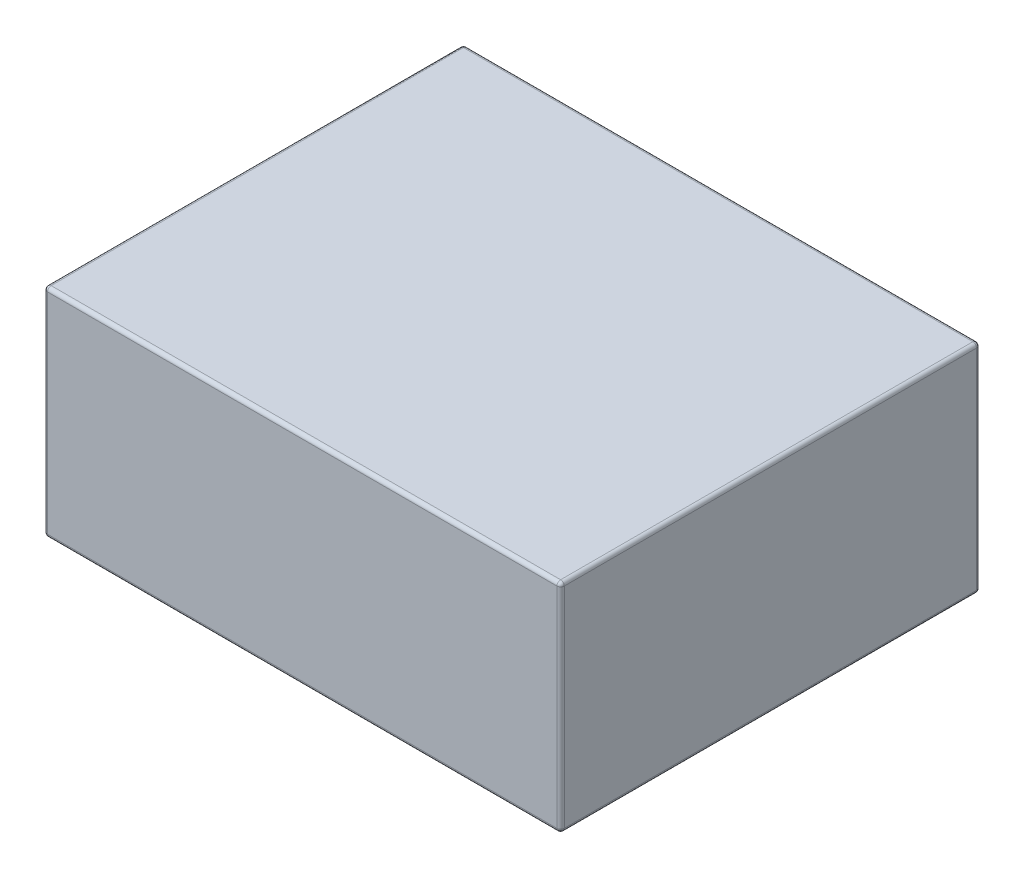
ISO-10303-21;
HEADER;
FILE_DESCRIPTION(('STEP AP214'),'2;1');
FILE_NAME('part.step','',(''),(''),'','','');
FILE_SCHEMA(('AUTOMOTIVE_DESIGN { 1 0 10303 214 1 1 1 1 }'));
ENDSEC;
DATA;
#1=APPLICATION_CONTEXT('core data for automotive mechanical design processes');
#2=APPLICATION_PROTOCOL_DEFINITION('international standard','automotive_design',2000,#1);
#3=PRODUCT_CONTEXT('',#1,'mechanical');
#4=PRODUCT('Part','Part','',(#3));
#5=PRODUCT_RELATED_PRODUCT_CATEGORY('part','',(#4));
#6=PRODUCT_DEFINITION_FORMATION('','',#4);
#7=PRODUCT_DEFINITION_CONTEXT('part definition',#1,'design');
#8=PRODUCT_DEFINITION('design','',#6,#7);
#9=PRODUCT_DEFINITION_SHAPE('','',#8);
#10=(LENGTH_UNIT() NAMED_UNIT(*) SI_UNIT(.MILLI.,.METRE.));
#11=(NAMED_UNIT(*) PLANE_ANGLE_UNIT() SI_UNIT($,.RADIAN.));
#12=(NAMED_UNIT(*) SI_UNIT($,.STERADIAN.) SOLID_ANGLE_UNIT());
#13=UNCERTAINTY_MEASURE_WITH_UNIT(LENGTH_MEASURE(1.E-05),#10,'distance_accuracy_value','');
#14=(GEOMETRIC_REPRESENTATION_CONTEXT(3) GLOBAL_UNCERTAINTY_ASSIGNED_CONTEXT((#13)) GLOBAL_UNIT_ASSIGNED_CONTEXT((#10,
#11,#12)) REPRESENTATION_CONTEXT('',''));
#15=CARTESIAN_POINT('',(0.,0.,0.));
#16=DIRECTION('',(0.,0.,1.));
#17=DIRECTION('',(1.,0.,0.));
#18=AXIS2_PLACEMENT_3D('',#15,#16,#17);
#19=CARTESIAN_POINT('',(31.8430685227295,13.2247842722642,144.526));
#20=DIRECTION('',(1.,0.,0.));
#21=DIRECTION('',(0.,1.,0.));
#22=AXIS2_PLACEMENT_3D('',#19,#20,#21);
#23=SPHERICAL_SURFACE('',#22,1.27);
#24=CARTESIAN_POINT('',(31.8430685227295,13.2247842722642,144.526));
#25=DIRECTION('',(0.,0.,1.));
#26=DIRECTION('',(1.,0.,0.));
#27=AXIS2_PLACEMENT_3D('',#24,#25,#26);
#28=CIRCLE('',#27,1.27);
#29=CARTESIAN_POINT('',(31.8430685227295,14.4947842722642,144.526));
#30=VERTEX_POINT('',#29);
#31=CARTESIAN_POINT('',(33.1130685227295,13.2247842722642,144.526));
#32=VERTEX_POINT('',#31);
#33=EDGE_CURVE('E109',#30,#32,#28,.F.);
#34=ORIENTED_EDGE('',*,*,#33,.F.);
#35=CARTESIAN_POINT('',(31.8430685227295,13.2247842722642,144.526));
#36=DIRECTION('',(1.,0.,0.));
#37=DIRECTION('',(0.,1.,0.));
#38=AXIS2_PLACEMENT_3D('',#35,#36,#37);
#39=CIRCLE('',#38,1.27);
#40=CARTESIAN_POINT('',(31.8430685227295,13.2247842722642,145.796));
#41=VERTEX_POINT('',#40);
#42=EDGE_CURVE('E111',#41,#30,#39,.F.);
#43=ORIENTED_EDGE('',*,*,#42,.F.);
#44=CARTESIAN_POINT('',(31.8430685227295,13.2247842722642,144.526));
#45=DIRECTION('',(0.,-1.,0.));
#46=DIRECTION('',(1.,0.,0.));
#47=AXIS2_PLACEMENT_3D('',#44,#45,#46);
#48=CIRCLE('',#47,1.27);
#49=EDGE_CURVE('E113',#32,#41,#48,.T.);
#50=ORIENTED_EDGE('',*,*,#49,.F.);
#51=EDGE_LOOP('',(#34,#43,#50));
#52=FACE_BOUND('',#51,.T.);
#53=ADVANCED_FACE('F16',(#52),#23,.T.);
#54=CARTESIAN_POINT('',(-145.194931477271,13.2247842722642,144.526));
#55=DIRECTION('',(1.,0.,0.));
#56=DIRECTION('',(0.,1.,0.));
#57=AXIS2_PLACEMENT_3D('',#54,#55,#56);
#58=SPHERICAL_SURFACE('',#57,1.27000000000001);
#59=CARTESIAN_POINT('',(-145.194931477271,13.2247842722642,144.526));
#60=DIRECTION('',(0.,0.,1.));
#61=DIRECTION('',(1.,0.,0.));
#62=AXIS2_PLACEMENT_3D('',#59,#60,#61);
#63=CIRCLE('',#62,1.27);
#64=CARTESIAN_POINT('',(-146.464931477271,13.2247842722642,144.526));
#65=VERTEX_POINT('',#64);
#66=CARTESIAN_POINT('',(-145.194931477271,14.4947842722642,144.526));
#67=VERTEX_POINT('',#66);
#68=EDGE_CURVE('E316',#65,#67,#63,.F.);
#69=ORIENTED_EDGE('',*,*,#68,.F.);
#70=CARTESIAN_POINT('',(-145.194931477271,13.2247842722642,144.526));
#71=DIRECTION('',(0.,1.,0.));
#72=DIRECTION('',(0.,0.,1.));
#73=AXIS2_PLACEMENT_3D('',#70,#71,#72);
#74=CIRCLE('',#73,1.27);
#75=CARTESIAN_POINT('',(-145.194931477271,13.2247842722797,145.796));
#76=VERTEX_POINT('',#75);
#77=EDGE_CURVE('E309',#76,#65,#74,.F.);
#78=ORIENTED_EDGE('',*,*,#77,.F.);
#79=CARTESIAN_POINT('',(-145.194931477271,13.2247842722642,144.526));
#80=DIRECTION('',(1.,0.,0.));
#81=DIRECTION('',(0.,1.,0.));
#82=AXIS2_PLACEMENT_3D('',#79,#80,#81);
#83=CIRCLE('',#82,1.27);
#84=EDGE_CURVE('E133',#67,#76,#83,.T.);
#85=ORIENTED_EDGE('',*,*,#84,.F.);
#86=EDGE_LOOP('',(#69,#78,#85));
#87=FACE_BOUND('',#86,.T.);
#88=ADVANCED_FACE('F155',(#87),#58,.T.);
#89=CARTESIAN_POINT('',(-145.194931477271,13.2247842722642,1.27));
#90=DIRECTION('',(1.,0.,0.));
#91=DIRECTION('',(0.,1.,0.));
#92=AXIS2_PLACEMENT_3D('',#89,#90,#91);
#93=SPHERICAL_SURFACE('',#92,1.27);
#94=CARTESIAN_POINT('',(-145.194931477271,13.2247842722642,1.27));
#95=DIRECTION('',(1.,0.,0.));
#96=DIRECTION('',(0.,1.,0.));
#97=AXIS2_PLACEMENT_3D('',#94,#95,#96);
#98=CIRCLE('',#97,1.27);
#99=CARTESIAN_POINT('',(-145.194931477271,13.2247842722642,0.));
#100=VERTEX_POINT('',#99);
#101=CARTESIAN_POINT('',(-145.194931477271,14.4947842722642,1.27));
#102=VERTEX_POINT('',#101);
#103=EDGE_CURVE('E300',#100,#102,#98,.T.);
#104=ORIENTED_EDGE('',*,*,#103,.F.);
#105=CARTESIAN_POINT('',(-145.194931477271,13.2247842722642,1.27));
#106=DIRECTION('',(0.,1.,0.));
#107=DIRECTION('',(0.,0.,1.));
#108=AXIS2_PLACEMENT_3D('',#105,#106,#107);
#109=CIRCLE('',#108,1.27);
#110=CARTESIAN_POINT('',(-146.46493147727,13.2247842722642,1.27));
#111=VERTEX_POINT('',#110);
#112=EDGE_CURVE('E306',#111,#100,#109,.F.);
#113=ORIENTED_EDGE('',*,*,#112,.F.);
#114=CARTESIAN_POINT('',(-145.194931477271,13.2247842722642,1.27));
#115=DIRECTION('',(0.,0.,1.));
#116=DIRECTION('',(1.,0.,0.));
#117=AXIS2_PLACEMENT_3D('',#114,#115,#116);
#118=CIRCLE('',#117,1.27);
#119=EDGE_CURVE('E312',#102,#111,#118,.T.);
#120=ORIENTED_EDGE('',*,*,#119,.F.);
#121=EDGE_LOOP('',(#104,#113,#120));
#122=FACE_BOUND('',#121,.T.);
#123=ADVANCED_FACE('F153',(#122),#93,.T.);
#124=CARTESIAN_POINT('',(-146.46493147727,14.4947842722642,0.));
#125=DIRECTION('',(0.,1.,0.));
#126=DIRECTION('',(-1.,0.,0.));
#127=AXIS2_PLACEMENT_3D('',#124,#125,#126);
#128=PLANE('',#127);
#129=DIRECTION('',(0.,0.,1.));
#130=VECTOR('',#129,1.);
#131=CARTESIAN_POINT('',(31.8430685227295,14.4947842722642,0.));
#132=LINE('',#131,#130);
#133=CARTESIAN_POINT('',(31.8430685227295,14.4947842722642,1.27));
#134=VERTEX_POINT('',#133);
#135=EDGE_CURVE('E104',#134,#30,#132,.T.);
#136=ORIENTED_EDGE('',*,*,#135,.F.);
#137=DIRECTION('',(1.,0.,0.));
#138=VECTOR('',#137,1.);
#139=CARTESIAN_POINT('',(-101.570431477271,14.4947842722642,1.27));
#140=LINE('',#139,#138);
#141=EDGE_CURVE('E296',#102,#134,#140,.T.);
#142=ORIENTED_EDGE('',*,*,#141,.F.);
#143=DIRECTION('',(0.,0.,1.));
#144=VECTOR('',#143,1.);
#145=CARTESIAN_POINT('',(-145.194931477271,14.4947842722642,0.));
#146=LINE('',#145,#144);
#147=EDGE_CURVE('E132',#67,#102,#146,.F.);
#148=ORIENTED_EDGE('',*,*,#147,.F.);
#149=DIRECTION('',(1.,0.,0.));
#150=VECTOR('',#149,1.);
#151=CARTESIAN_POINT('',(-101.570431477271,14.4947842722642,144.526));
#152=LINE('',#151,#150);
#153=EDGE_CURVE('E124',#30,#67,#152,.F.);
#154=ORIENTED_EDGE('',*,*,#153,.F.);
#155=EDGE_LOOP('',(#136,#142,#148,#154));
#156=FACE_BOUND('',#155,.T.);
#157=ADVANCED_FACE('F130',(#156),#128,.T.);
#158=CARTESIAN_POINT('',(31.8430685227295,13.2247842722642,1.27));
#159=DIRECTION('',(1.,0.,0.));
#160=DIRECTION('',(0.,1.,0.));
#161=AXIS2_PLACEMENT_3D('',#158,#159,#160);
#162=SPHERICAL_SURFACE('',#161,1.27);
#163=CARTESIAN_POINT('',(31.8430685227295,13.2247842722642,1.27));
#164=DIRECTION('',(1.,0.,0.));
#165=DIRECTION('',(0.,1.,0.));
#166=AXIS2_PLACEMENT_3D('',#163,#164,#165);
#167=CIRCLE('',#166,1.27);
#168=CARTESIAN_POINT('',(31.8430685227295,13.2247842722798,0.));
#169=VERTEX_POINT('',#168);
#170=EDGE_CURVE('E303',#134,#169,#167,.F.);
#171=ORIENTED_EDGE('',*,*,#170,.F.);
#172=CARTESIAN_POINT('',(31.8430685227295,13.2247842722642,1.27));
#173=DIRECTION('',(0.,0.,1.));
#174=DIRECTION('',(1.,0.,0.));
#175=AXIS2_PLACEMENT_3D('',#172,#173,#174);
#176=CIRCLE('',#175,1.27);
#177=CARTESIAN_POINT('',(33.1130685227295,13.2247842722642,1.27));
#178=VERTEX_POINT('',#177);
#179=EDGE_CURVE('E117',#178,#134,#176,.T.);
#180=ORIENTED_EDGE('',*,*,#179,.F.);
#181=CARTESIAN_POINT('',(31.8430685227295,13.2247842722642,1.27));
#182=DIRECTION('',(0.,-1.,0.));
#183=DIRECTION('',(1.,0.,0.));
#184=AXIS2_PLACEMENT_3D('',#181,#182,#183);
#185=CIRCLE('',#184,1.27);
#186=EDGE_CURVE('E294',#169,#178,#185,.T.);
#187=ORIENTED_EDGE('',*,*,#186,.F.);
#188=EDGE_LOOP('',(#171,#180,#187));
#189=FACE_BOUND('',#188,.T.);
#190=ADVANCED_FACE('F145',(#189),#162,.T.);
#191=CARTESIAN_POINT('',(31.8430685227295,13.2247842722642,0.));
#192=DIRECTION('',(0.,0.,1.));
#193=DIRECTION('',(1.,0.,0.));
#194=AXIS2_PLACEMENT_3D('',#191,#192,#193);
#195=CYLINDRICAL_SURFACE('',#194,1.27);
#196=ORIENTED_EDGE('',*,*,#179,.T.);
#197=ORIENTED_EDGE('',*,*,#135,.T.);
#198=ORIENTED_EDGE('',*,*,#33,.T.);
#199=DIRECTION('',(0.,0.,1.));
#200=VECTOR('',#199,1.);
#201=CARTESIAN_POINT('',(33.1130685227295,13.2247842722642,0.));
#202=LINE('',#201,#200);
#203=EDGE_CURVE('E290',#178,#32,#202,.T.);
#204=ORIENTED_EDGE('',*,*,#203,.F.);
#205=EDGE_LOOP('',(#196,#197,#198,#204));
#206=FACE_BOUND('',#205,.T.);
#207=ADVANCED_FACE('F136',(#206),#195,.T.);
#208=CARTESIAN_POINT('',(31.8430685227295,-4.36471572773582,144.526));
#209=DIRECTION('',(0.,-1.,0.));
#210=DIRECTION('',(1.,0.,0.));
#211=AXIS2_PLACEMENT_3D('',#208,#209,#210);
#212=CYLINDRICAL_SURFACE('',#211,1.27);
#213=ORIENTED_EDGE('',*,*,#49,.T.);
#214=DIRECTION('',(0.,1.,0.));
#215=VECTOR('',#214,1.);
#216=CARTESIAN_POINT('',(31.8430685227295,-23.2242157277358,145.796));
#217=LINE('',#216,#215);
#218=CARTESIAN_POINT('',(31.8430685227295,-59.6732157277357,145.796));
#219=VERTEX_POINT('',#218);
#220=EDGE_CURVE('E238',#219,#41,#217,.T.);
#221=ORIENTED_EDGE('',*,*,#220,.F.);
#222=CARTESIAN_POINT('',(31.8430685227295,-59.6732157277357,144.526));
#223=DIRECTION('',(0.,-1.,0.));
#224=DIRECTION('',(1.,0.,0.));
#225=AXIS2_PLACEMENT_3D('',#222,#223,#224);
#226=CIRCLE('',#225,1.27);
#227=CARTESIAN_POINT('',(33.1130685227295,-59.6732157277357,144.526));
#228=VERTEX_POINT('',#227);
#229=EDGE_CURVE('E243',#228,#219,#226,.T.);
#230=ORIENTED_EDGE('',*,*,#229,.F.);
#231=DIRECTION('',(0.,1.,0.));
#232=VECTOR('',#231,1.);
#233=CARTESIAN_POINT('',(33.1130685227295,14.4947842722642,144.526));
#234=LINE('',#233,#232);
#235=EDGE_CURVE('E284',#32,#228,#234,.F.);
#236=ORIENTED_EDGE('',*,*,#235,.F.);
#237=EDGE_LOOP('',(#213,#221,#230,#236));
#238=FACE_BOUND('',#237,.T.);
#239=ADVANCED_FACE('F276',(#238),#212,.T.);
#240=CARTESIAN_POINT('',(-101.570431477271,13.2247842722642,144.526));
#241=DIRECTION('',(1.,0.,0.));
#242=DIRECTION('',(0.,1.,0.));
#243=AXIS2_PLACEMENT_3D('',#240,#241,#242);
#244=CYLINDRICAL_SURFACE('',#243,1.27);
#245=ORIENTED_EDGE('',*,*,#84,.T.);
#246=DIRECTION('',(1.,0.,0.));
#247=VECTOR('',#246,1.);
#248=CARTESIAN_POINT('',(-56.6759314772705,13.2247842722642,145.796));
#249=LINE('',#248,#247);
#250=EDGE_CURVE('E126',#41,#76,#249,.F.);
#251=ORIENTED_EDGE('',*,*,#250,.F.);
#252=ORIENTED_EDGE('',*,*,#42,.T.);
#253=ORIENTED_EDGE('',*,*,#153,.T.);
#254=EDGE_LOOP('',(#245,#251,#252,#253));
#255=FACE_BOUND('',#254,.T.);
#256=ADVANCED_FACE('F123',(#255),#244,.T.);
#257=CARTESIAN_POINT('',(-145.194931477271,13.2247842722642,0.));
#258=DIRECTION('',(0.,0.,1.));
#259=DIRECTION('',(1.,0.,0.));
#260=AXIS2_PLACEMENT_3D('',#257,#258,#259);
#261=CYLINDRICAL_SURFACE('',#260,1.27);
#262=ORIENTED_EDGE('',*,*,#119,.T.);
#263=DIRECTION('',(0.,0.,1.));
#264=VECTOR('',#263,1.);
#265=CARTESIAN_POINT('',(-146.46493147727,13.2247842722642,0.));
#266=LINE('',#265,#264);
#267=EDGE_CURVE('E232',#65,#111,#266,.F.);
#268=ORIENTED_EDGE('',*,*,#267,.F.);
#269=ORIENTED_EDGE('',*,*,#68,.T.);
#270=ORIENTED_EDGE('',*,*,#147,.T.);
#271=EDGE_LOOP('',(#262,#268,#269,#270));
#272=FACE_BOUND('',#271,.T.);
#273=ADVANCED_FACE('F270',(#272),#261,.T.);
#274=CARTESIAN_POINT('',(-145.194931477271,-42.0837157277358,144.526));
#275=DIRECTION('',(0.,1.,0.));
#276=DIRECTION('',(0.,0.,1.));
#277=AXIS2_PLACEMENT_3D('',#274,#275,#276);
#278=CYLINDRICAL_SURFACE('',#277,1.27);
#279=CARTESIAN_POINT('',(-145.194931477271,-59.6732157277357,144.526));
#280=DIRECTION('',(0.,-1.,0.));
#281=DIRECTION('',(1.,0.,0.));
#282=AXIS2_PLACEMENT_3D('',#279,#280,#281);
#283=CIRCLE('',#282,1.27);
#284=CARTESIAN_POINT('',(-145.194931477271,-59.6732157277357,145.796));
#285=VERTEX_POINT('',#284);
#286=CARTESIAN_POINT('',(-146.46493147727,-59.6732157277357,144.526));
#287=VERTEX_POINT('',#286);
#288=EDGE_CURVE('E234',#285,#287,#283,.T.);
#289=ORIENTED_EDGE('',*,*,#288,.F.);
#290=DIRECTION('',(0.,1.,0.));
#291=VECTOR('',#290,1.);
#292=CARTESIAN_POINT('',(-145.194931477271,-23.2242157277358,145.796));
#293=LINE('',#292,#291);
#294=EDGE_CURVE('E240',#76,#285,#293,.F.);
#295=ORIENTED_EDGE('',*,*,#294,.F.);
#296=ORIENTED_EDGE('',*,*,#77,.T.);
#297=DIRECTION('',(0.,1.,0.));
#298=VECTOR('',#297,1.);
#299=CARTESIAN_POINT('',(-146.46493147727,-60.9432157277357,144.526));
#300=LINE('',#299,#298);
#301=EDGE_CURVE('E369',#287,#65,#300,.T.);
#302=ORIENTED_EDGE('',*,*,#301,.F.);
#303=EDGE_LOOP('',(#289,#295,#296,#302));
#304=FACE_BOUND('',#303,.T.);
#305=ADVANCED_FACE('F266',(#304),#278,.T.);
#306=CARTESIAN_POINT('',(-145.194931477271,-42.0837157277358,1.27));
#307=DIRECTION('',(0.,1.,0.));
#308=DIRECTION('',(0.,0.,1.));
#309=AXIS2_PLACEMENT_3D('',#306,#307,#308);
#310=CYLINDRICAL_SURFACE('',#309,1.27);
#311=CARTESIAN_POINT('',(-145.194931477271,-59.6732157277357,1.27));
#312=DIRECTION('',(0.,1.,0.));
#313=DIRECTION('',(1.,0.,0.));
#314=AXIS2_PLACEMENT_3D('',#311,#312,#313);
#315=CIRCLE('',#314,1.27);
#316=CARTESIAN_POINT('',(-146.46493147727,-59.6732157277357,1.27));
#317=VERTEX_POINT('',#316);
#318=CARTESIAN_POINT('',(-145.194931477271,-59.6732157277358,0.));
#319=VERTEX_POINT('',#318);
#320=EDGE_CURVE('E211',#317,#319,#315,.F.);
#321=ORIENTED_EDGE('',*,*,#320,.F.);
#322=DIRECTION('',(0.,1.,0.));
#323=VECTOR('',#322,1.);
#324=CARTESIAN_POINT('',(-146.46493147727,-60.9432157277357,1.27));
#325=LINE('',#324,#323);
#326=EDGE_CURVE('E371',#111,#317,#325,.F.);
#327=ORIENTED_EDGE('',*,*,#326,.F.);
#328=ORIENTED_EDGE('',*,*,#112,.T.);
#329=DIRECTION('',(0.,1.,0.));
#330=VECTOR('',#329,1.);
#331=CARTESIAN_POINT('',(-145.194931477271,-23.2242157277358,0.));
#332=LINE('',#331,#330);
#333=EDGE_CURVE('E209',#100,#319,#332,.F.);
#334=ORIENTED_EDGE('',*,*,#333,.T.);
#335=EDGE_LOOP('',(#321,#327,#328,#334));
#336=FACE_BOUND('',#335,.T.);
#337=ADVANCED_FACE('F262',(#336),#310,.T.);
#338=CARTESIAN_POINT('',(-101.570431477271,13.2247842722642,1.27));
#339=DIRECTION('',(1.,0.,0.));
#340=DIRECTION('',(0.,1.,0.));
#341=AXIS2_PLACEMENT_3D('',#338,#339,#340);
#342=CYLINDRICAL_SURFACE('',#341,1.27);
#343=ORIENTED_EDGE('',*,*,#103,.T.);
#344=ORIENTED_EDGE('',*,*,#141,.T.);
#345=ORIENTED_EDGE('',*,*,#170,.T.);
#346=DIRECTION('',(1.,0.,0.));
#347=VECTOR('',#346,1.);
#348=CARTESIAN_POINT('',(-56.6759314772705,13.2247842722642,0.));
#349=LINE('',#348,#347);
#350=EDGE_CURVE('E203',#169,#100,#349,.F.);
#351=ORIENTED_EDGE('',*,*,#350,.T.);
#352=EDGE_LOOP('',(#343,#344,#345,#351));
#353=FACE_BOUND('',#352,.T.);
#354=ADVANCED_FACE('F258',(#353),#342,.T.);
#355=CARTESIAN_POINT('',(31.8430685227295,-4.36471572773582,1.27));
#356=DIRECTION('',(0.,-1.,0.));
#357=DIRECTION('',(1.,0.,0.));
#358=AXIS2_PLACEMENT_3D('',#355,#356,#357);
#359=CYLINDRICAL_SURFACE('',#358,1.27);
#360=ORIENTED_EDGE('',*,*,#186,.T.);
#361=DIRECTION('',(0.,1.,0.));
#362=VECTOR('',#361,1.);
#363=CARTESIAN_POINT('',(33.1130685227295,14.4947842722642,1.27));
#364=LINE('',#363,#362);
#365=CARTESIAN_POINT('',(33.1130685227295,-59.6732157277357,1.27));
#366=VERTEX_POINT('',#365);
#367=EDGE_CURVE('E289',#366,#178,#364,.T.);
#368=ORIENTED_EDGE('',*,*,#367,.F.);
#369=CARTESIAN_POINT('',(31.8430685227295,-59.6732157277357,1.27));
#370=DIRECTION('',(0.,1.,0.));
#371=DIRECTION('',(1.,0.,0.));
#372=AXIS2_PLACEMENT_3D('',#369,#370,#371);
#373=CIRCLE('',#372,1.27000000000001);
#374=CARTESIAN_POINT('',(31.8430685227295,-59.6732157277357,0.));
#375=VERTEX_POINT('',#374);
#376=EDGE_CURVE('E200',#375,#366,#373,.F.);
#377=ORIENTED_EDGE('',*,*,#376,.F.);
#378=DIRECTION('',(0.,1.,0.));
#379=VECTOR('',#378,1.);
#380=CARTESIAN_POINT('',(31.8430685227295,-23.2242157277358,0.));
#381=LINE('',#380,#379);
#382=EDGE_CURVE('E206',#375,#169,#381,.T.);
#383=ORIENTED_EDGE('',*,*,#382,.T.);
#384=EDGE_LOOP('',(#360,#368,#377,#383));
#385=FACE_BOUND('',#384,.T.);
#386=ADVANCED_FACE('F254',(#385),#359,.T.);
#387=CARTESIAN_POINT('',(33.1130685227295,14.4947842722642,0.));
#388=DIRECTION('',(1.,0.,0.));
#389=DIRECTION('',(0.,1.,0.));
#390=AXIS2_PLACEMENT_3D('',#387,#388,#389);
#391=PLANE('',#390);
#392=DIRECTION('',(0.,0.,1.));
#393=VECTOR('',#392,1.);
#394=CARTESIAN_POINT('',(33.1130685227295,-59.6732157277357,0.));
#395=LINE('',#394,#393);
#396=EDGE_CURVE('E336',#366,#228,#395,.T.);
#397=ORIENTED_EDGE('',*,*,#396,.F.);
#398=ORIENTED_EDGE('',*,*,#367,.T.);
#399=ORIENTED_EDGE('',*,*,#203,.T.);
#400=ORIENTED_EDGE('',*,*,#235,.T.);
#401=EDGE_LOOP('',(#397,#398,#399,#400));
#402=FACE_BOUND('',#401,.T.);
#403=ADVANCED_FACE('F250',(#402),#391,.T.);
#404=CARTESIAN_POINT('',(31.8430685227295,-59.6732157277357,144.526));
#405=DIRECTION('',(1.,0.,0.));
#406=DIRECTION('',(0.,1.,0.));
#407=AXIS2_PLACEMENT_3D('',#404,#405,#406);
#408=SPHERICAL_SURFACE('',#407,1.27);
#409=CARTESIAN_POINT('',(31.8430685227295,-59.6732157277357,144.526));
#410=DIRECTION('',(0.,0.,1.));
#411=DIRECTION('',(1.,0.,0.));
#412=AXIS2_PLACEMENT_3D('',#409,#410,#411);
#413=CIRCLE('',#412,1.27);
#414=CARTESIAN_POINT('',(31.8430685227295,-60.9432157277357,144.526));
#415=VERTEX_POINT('',#414);
#416=EDGE_CURVE('E198',#228,#415,#413,.F.);
#417=ORIENTED_EDGE('',*,*,#416,.F.);
#418=ORIENTED_EDGE('',*,*,#229,.T.);
#419=CARTESIAN_POINT('',(31.8430685227295,-59.6732157277357,144.526));
#420=DIRECTION('',(-1.,0.,0.));
#421=DIRECTION('',(0.,-1.,0.));
#422=AXIS2_PLACEMENT_3D('',#419,#420,#421);
#423=CIRCLE('',#422,1.27);
#424=EDGE_CURVE('E327',#415,#219,#423,.T.);
#425=ORIENTED_EDGE('',*,*,#424,.F.);
#426=EDGE_LOOP('',(#417,#418,#425));
#427=FACE_BOUND('',#426,.T.);
#428=ADVANCED_FACE('F247',(#427),#408,.T.);
#429=CARTESIAN_POINT('',(-56.6759314772705,-23.2242157277358,145.796));
#430=DIRECTION('',(0.,0.,1.));
#431=DIRECTION('',(1.,0.,0.));
#432=AXIS2_PLACEMENT_3D('',#429,#430,#431);
#433=PLANE('',#432);
#434=ORIENTED_EDGE('',*,*,#220,.T.);
#435=ORIENTED_EDGE('',*,*,#250,.T.);
#436=ORIENTED_EDGE('',*,*,#294,.T.);
#437=DIRECTION('',(-1.,0.,0.));
#438=VECTOR('',#437,1.);
#439=CARTESIAN_POINT('',(-11.7814314772705,-59.6732157277357,145.796));
#440=LINE('',#439,#438);
#441=EDGE_CURVE('E323',#219,#285,#440,.T.);
#442=ORIENTED_EDGE('',*,*,#441,.F.);
#443=EDGE_LOOP('',(#434,#435,#436,#442));
#444=FACE_BOUND('',#443,.T.);
#445=ADVANCED_FACE('F226',(#444),#433,.T.);
#446=CARTESIAN_POINT('',(-145.194931477271,-59.6732157277357,144.526));
#447=DIRECTION('',(1.,0.,0.));
#448=DIRECTION('',(0.,1.,0.));
#449=AXIS2_PLACEMENT_3D('',#446,#447,#448);
#450=SPHERICAL_SURFACE('',#449,1.27);
#451=CARTESIAN_POINT('',(-145.194931477271,-59.6732157277357,144.526));
#452=DIRECTION('',(0.,0.,1.));
#453=DIRECTION('',(1.,0.,0.));
#454=AXIS2_PLACEMENT_3D('',#451,#452,#453);
#455=CIRCLE('',#454,1.27);
#456=CARTESIAN_POINT('',(-145.194931477271,-60.9432157277357,144.526));
#457=VERTEX_POINT('',#456);
#458=EDGE_CURVE('E326',#457,#287,#455,.F.);
#459=ORIENTED_EDGE('',*,*,#458,.F.);
#460=CARTESIAN_POINT('',(-145.194931477271,-59.6732157277358,144.526));
#461=DIRECTION('',(-1.,0.,0.));
#462=DIRECTION('',(0.,-1.,0.));
#463=AXIS2_PLACEMENT_3D('',#460,#461,#462);
#464=CIRCLE('',#463,1.27);
#465=EDGE_CURVE('E334',#285,#457,#464,.F.);
#466=ORIENTED_EDGE('',*,*,#465,.F.);
#467=ORIENTED_EDGE('',*,*,#288,.T.);
#468=EDGE_LOOP('',(#459,#466,#467));
#469=FACE_BOUND('',#468,.T.);
#470=ADVANCED_FACE('F221',(#469),#450,.T.);
#471=CARTESIAN_POINT('',(-146.46493147727,-60.9432157277357,0.));
#472=DIRECTION('',(-1.,0.,0.));
#473=DIRECTION('',(0.,0.,1.));
#474=AXIS2_PLACEMENT_3D('',#471,#472,#473);
#475=PLANE('',#474);
#476=DIRECTION('',(0.,0.,1.));
#477=VECTOR('',#476,1.);
#478=CARTESIAN_POINT('',(-146.46493147727,-59.6732157277357,0.));
#479=LINE('',#478,#477);
#480=EDGE_CURVE('E362',#287,#317,#479,.F.);
#481=ORIENTED_EDGE('',*,*,#480,.F.);
#482=ORIENTED_EDGE('',*,*,#301,.T.);
#483=ORIENTED_EDGE('',*,*,#267,.T.);
#484=ORIENTED_EDGE('',*,*,#326,.T.);
#485=EDGE_LOOP('',(#481,#482,#483,#484));
#486=FACE_BOUND('',#485,.T.);
#487=ADVANCED_FACE('F218',(#486),#475,.T.);
#488=CARTESIAN_POINT('',(-145.194931477271,-59.6732157277357,1.27));
#489=DIRECTION('',(1.,0.,0.));
#490=DIRECTION('',(0.,1.,0.));
#491=AXIS2_PLACEMENT_3D('',#488,#489,#490);
#492=SPHERICAL_SURFACE('',#491,1.27);
#493=CARTESIAN_POINT('',(-145.194931477271,-59.6732157277358,1.27));
#494=DIRECTION('',(-1.,0.,0.));
#495=DIRECTION('',(0.,-1.,0.));
#496=AXIS2_PLACEMENT_3D('',#493,#494,#495);
#497=CIRCLE('',#496,1.27);
#498=CARTESIAN_POINT('',(-145.194931477271,-60.9432157277357,1.27));
#499=VERTEX_POINT('',#498);
#500=EDGE_CURVE('E34',#499,#319,#497,.F.);
#501=ORIENTED_EDGE('',*,*,#500,.F.);
#502=CARTESIAN_POINT('',(-145.194931477271,-59.6732157277357,1.27));
#503=DIRECTION('',(0.,0.,1.));
#504=DIRECTION('',(1.,0.,0.));
#505=AXIS2_PLACEMENT_3D('',#502,#503,#504);
#506=CIRCLE('',#505,1.27);
#507=EDGE_CURVE('E360',#317,#499,#506,.T.);
#508=ORIENTED_EDGE('',*,*,#507,.F.);
#509=ORIENTED_EDGE('',*,*,#320,.T.);
#510=EDGE_LOOP('',(#501,#508,#509));
#511=FACE_BOUND('',#510,.T.);
#512=ADVANCED_FACE('F215',(#511),#492,.T.);
#513=CARTESIAN_POINT('',(-56.6759314772705,-23.2242157277358,0.));
#514=DIRECTION('',(0.,0.,1.));
#515=DIRECTION('',(1.,0.,0.));
#516=AXIS2_PLACEMENT_3D('',#513,#514,#515);
#517=PLANE('',#516);
#518=ORIENTED_EDGE('',*,*,#382,.F.);
#519=DIRECTION('',(-1.,0.,0.));
#520=VECTOR('',#519,1.);
#521=CARTESIAN_POINT('',(-11.7814314772705,-59.6732157277357,0.));
#522=LINE('',#521,#520);
#523=EDGE_CURVE('E351',#319,#375,#522,.F.);
#524=ORIENTED_EDGE('',*,*,#523,.F.);
#525=ORIENTED_EDGE('',*,*,#333,.F.);
#526=ORIENTED_EDGE('',*,*,#350,.F.);
#527=EDGE_LOOP('',(#518,#524,#525,#526));
#528=FACE_BOUND('',#527,.T.);
#529=ADVANCED_FACE('F192',(#528),#517,.F.);
#530=CARTESIAN_POINT('',(31.8430685227295,-59.6732157277357,1.27));
#531=DIRECTION('',(1.,0.,0.));
#532=DIRECTION('',(0.,1.,0.));
#533=AXIS2_PLACEMENT_3D('',#530,#531,#532);
#534=SPHERICAL_SURFACE('',#533,1.27000000000001);
#535=ORIENTED_EDGE('',*,*,#376,.T.);
#536=CARTESIAN_POINT('',(31.8430685227295,-59.6732157277357,1.27));
#537=DIRECTION('',(0.,0.,1.));
#538=DIRECTION('',(1.,0.,0.));
#539=AXIS2_PLACEMENT_3D('',#536,#537,#538);
#540=CIRCLE('',#539,1.27);
#541=CARTESIAN_POINT('',(31.8430685227295,-60.9432157277357,1.27));
#542=VERTEX_POINT('',#541);
#543=EDGE_CURVE('E340',#542,#366,#540,.T.);
#544=ORIENTED_EDGE('',*,*,#543,.F.);
#545=CARTESIAN_POINT('',(31.8430685227295,-59.6732157277357,1.27));
#546=DIRECTION('',(-1.,0.,0.));
#547=DIRECTION('',(0.,-1.,0.));
#548=AXIS2_PLACEMENT_3D('',#545,#546,#547);
#549=CIRCLE('',#548,1.27);
#550=EDGE_CURVE('E345',#375,#542,#549,.T.);
#551=ORIENTED_EDGE('',*,*,#550,.F.);
#552=EDGE_LOOP('',(#535,#544,#551));
#553=FACE_BOUND('',#552,.T.);
#554=ADVANCED_FACE('F187',(#553),#534,.T.);
#555=CARTESIAN_POINT('',(31.8430685227295,-59.6732157277357,0.));
#556=DIRECTION('',(0.,0.,1.));
#557=DIRECTION('',(1.,0.,0.));
#558=AXIS2_PLACEMENT_3D('',#555,#556,#557);
#559=CYLINDRICAL_SURFACE('',#558,1.27);
#560=ORIENTED_EDGE('',*,*,#543,.T.);
#561=ORIENTED_EDGE('',*,*,#396,.T.);
#562=ORIENTED_EDGE('',*,*,#416,.T.);
#563=DIRECTION('',(0.,0.,1.));
#564=VECTOR('',#563,1.);
#565=CARTESIAN_POINT('',(31.8430685227295,-60.9432157277357,0.));
#566=LINE('',#565,#564);
#567=EDGE_CURVE('E343',#542,#415,#566,.T.);
#568=ORIENTED_EDGE('',*,*,#567,.F.);
#569=EDGE_LOOP('',(#560,#561,#562,#568));
#570=FACE_BOUND('',#569,.T.);
#571=ADVANCED_FACE('F183',(#570),#559,.T.);
#572=CARTESIAN_POINT('',(-11.7814314772705,-59.6732157277357,144.526));
#573=DIRECTION('',(-1.,0.,0.));
#574=DIRECTION('',(0.,-1.,0.));
#575=AXIS2_PLACEMENT_3D('',#572,#573,#574);
#576=CYLINDRICAL_SURFACE('',#575,1.27);
#577=ORIENTED_EDGE('',*,*,#424,.T.);
#578=ORIENTED_EDGE('',*,*,#441,.T.);
#579=ORIENTED_EDGE('',*,*,#465,.T.);
#580=DIRECTION('',(1.,0.,0.));
#581=VECTOR('',#580,1.);
#582=CARTESIAN_POINT('',(33.1130685227295,-60.9432157277357,144.526));
#583=LINE('',#582,#581);
#584=EDGE_CURVE('E331',#415,#457,#583,.F.);
#585=ORIENTED_EDGE('',*,*,#584,.F.);
#586=EDGE_LOOP('',(#577,#578,#579,#585));
#587=FACE_BOUND('',#586,.T.);
#588=ADVANCED_FACE('F179',(#587),#576,.T.);
#589=CARTESIAN_POINT('',(-145.194931477271,-59.6732157277357,0.));
#590=DIRECTION('',(0.,0.,1.));
#591=DIRECTION('',(1.,0.,0.));
#592=AXIS2_PLACEMENT_3D('',#589,#590,#591);
#593=CYLINDRICAL_SURFACE('',#592,1.27);
#594=ORIENTED_EDGE('',*,*,#507,.T.);
#595=DIRECTION('',(0.,0.,1.));
#596=VECTOR('',#595,1.);
#597=CARTESIAN_POINT('',(-145.194931477271,-60.9432157277357,0.));
#598=LINE('',#597,#596);
#599=EDGE_CURVE('E25',#457,#499,#598,.F.);
#600=ORIENTED_EDGE('',*,*,#599,.F.);
#601=ORIENTED_EDGE('',*,*,#458,.T.);
#602=ORIENTED_EDGE('',*,*,#480,.T.);
#603=EDGE_LOOP('',(#594,#600,#601,#602));
#604=FACE_BOUND('',#603,.T.);
#605=ADVANCED_FACE('F172',(#604),#593,.T.);
#606=CARTESIAN_POINT('',(-11.7814314772705,-59.6732157277357,1.27));
#607=DIRECTION('',(-1.,0.,0.));
#608=DIRECTION('',(0.,-1.,0.));
#609=AXIS2_PLACEMENT_3D('',#606,#607,#608);
#610=CYLINDRICAL_SURFACE('',#609,1.27);
#611=ORIENTED_EDGE('',*,*,#550,.T.);
#612=DIRECTION('',(1.,0.,0.));
#613=VECTOR('',#612,1.);
#614=CARTESIAN_POINT('',(33.1130685227295,-60.9432157277357,1.27));
#615=LINE('',#614,#613);
#616=EDGE_CURVE('E11',#499,#542,#615,.T.);
#617=ORIENTED_EDGE('',*,*,#616,.F.);
#618=ORIENTED_EDGE('',*,*,#500,.T.);
#619=ORIENTED_EDGE('',*,*,#523,.T.);
#620=EDGE_LOOP('',(#611,#617,#618,#619));
#621=FACE_BOUND('',#620,.T.);
#622=ADVANCED_FACE('F166',(#621),#610,.T.);
#623=CARTESIAN_POINT('',(33.1130685227295,-60.9432157277357,0.));
#624=DIRECTION('',(0.,-1.,0.));
#625=DIRECTION('',(1.,0.,0.));
#626=AXIS2_PLACEMENT_3D('',#623,#624,#625);
#627=PLANE('',#626);
#628=ORIENTED_EDGE('',*,*,#599,.T.);
#629=ORIENTED_EDGE('',*,*,#616,.T.);
#630=ORIENTED_EDGE('',*,*,#567,.T.);
#631=ORIENTED_EDGE('',*,*,#584,.T.);
#632=EDGE_LOOP('',(#628,#629,#630,#631));
#633=FACE_BOUND('',#632,.T.);
#634=ADVANCED_FACE('F164',(#633),#627,.T.);
#635=CLOSED_SHELL('',(#53,#88,#123,#157,#190,#207,#239,#256,#273,#305,#337,#354,#386,#403,#428,
#445,#470,#487,#512,#529,#554,#571,#588,#605,#622,#634));
#636=MANIFOLD_SOLID_BREP('B1',#635);
#637=ADVANCED_BREP_SHAPE_REPRESENTATION('',(#18,#636),#14);
#638=SHAPE_DEFINITION_REPRESENTATION(#9,#637);
ENDSEC;
END-ISO-10303-21;
